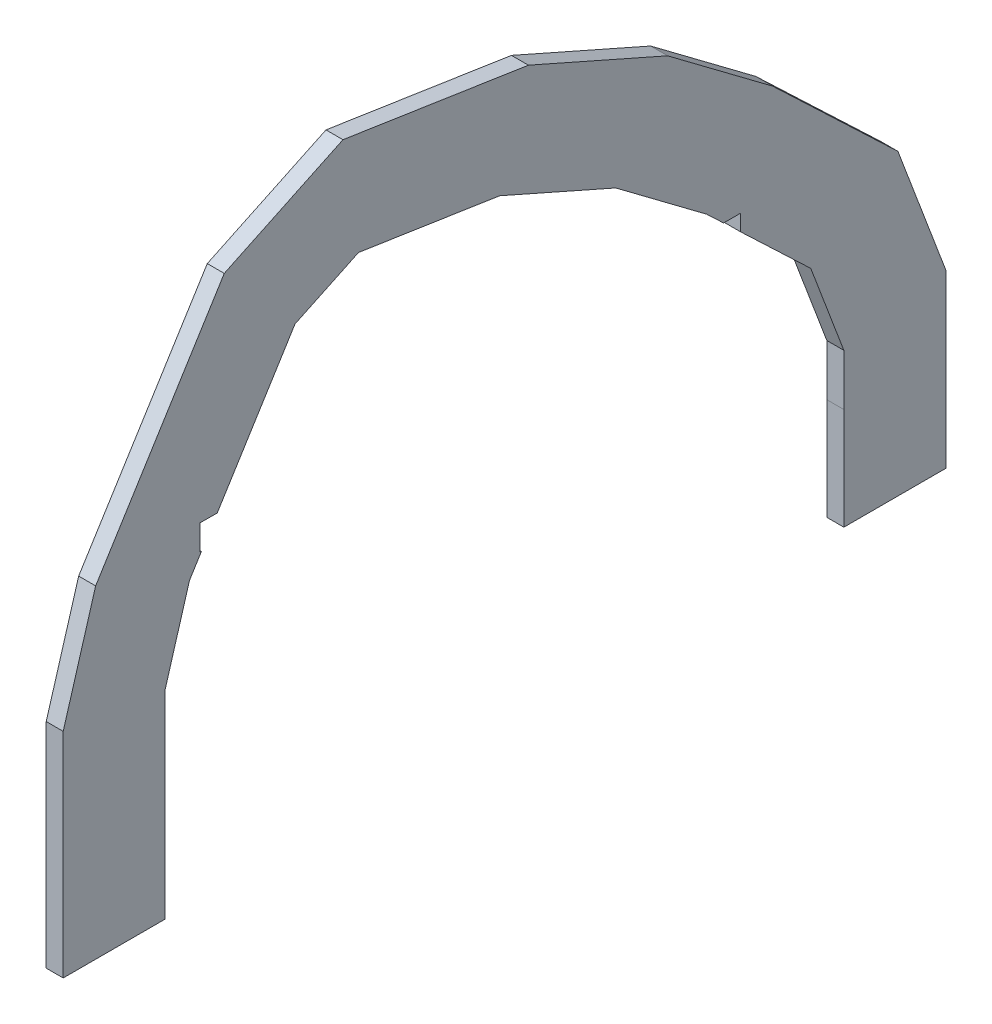
ISO-10303-21;
HEADER;
FILE_DESCRIPTION(('STEP AP214'),'2;1');
FILE_NAME('part.step','',(''),(''),'','','');
FILE_SCHEMA(('AUTOMOTIVE_DESIGN { 1 0 10303 214 1 1 1 1 }'));
ENDSEC;
DATA;
#1=APPLICATION_CONTEXT('core data for automotive mechanical design processes');
#2=APPLICATION_PROTOCOL_DEFINITION('international standard','automotive_design',2000,#1);
#3=PRODUCT_CONTEXT('',#1,'mechanical');
#4=PRODUCT('Part','Part','',(#3));
#5=PRODUCT_RELATED_PRODUCT_CATEGORY('part','',(#4));
#6=PRODUCT_DEFINITION_FORMATION('','',#4);
#7=PRODUCT_DEFINITION_CONTEXT('part definition',#1,'design');
#8=PRODUCT_DEFINITION('design','',#6,#7);
#9=PRODUCT_DEFINITION_SHAPE('','',#8);
#10=(LENGTH_UNIT() NAMED_UNIT(*) SI_UNIT(.MILLI.,.METRE.));
#11=(NAMED_UNIT(*) PLANE_ANGLE_UNIT() SI_UNIT($,.RADIAN.));
#12=(NAMED_UNIT(*) SI_UNIT($,.STERADIAN.) SOLID_ANGLE_UNIT());
#13=UNCERTAINTY_MEASURE_WITH_UNIT(LENGTH_MEASURE(1.E-05),#10,'distance_accuracy_value','');
#14=(GEOMETRIC_REPRESENTATION_CONTEXT(3) GLOBAL_UNCERTAINTY_ASSIGNED_CONTEXT((#13)) GLOBAL_UNIT_ASSIGNED_CONTEXT((#10,
#11,#12)) REPRESENTATION_CONTEXT('',''));
#15=CARTESIAN_POINT('',(0.,0.,0.));
#16=DIRECTION('',(0.,0.,1.));
#17=DIRECTION('',(1.,0.,0.));
#18=AXIS2_PLACEMENT_3D('',#15,#16,#17);
#19=CARTESIAN_POINT('',(-242.2525,21.7216118695721,64.8763127778716));
#20=DIRECTION('',(0.,0.,1.));
#21=DIRECTION('',(0.,1.,0.));
#22=AXIS2_PLACEMENT_3D('',#19,#20,#21);
#23=PLANE('',#22);
#24=DIRECTION('',(0.,-1.,0.));
#25=VECTOR('',#24,1.);
#26=CARTESIAN_POINT('',(-243.04625,39.5808520808741,64.8763127778719));
#27=LINE('',#26,#25);
#28=CARTESIAN_POINT('',(-243.04625,39.8318688402039,64.8763127778719));
#29=VERTEX_POINT('',#28);
#30=CARTESIAN_POINT('',(-243.04625,21.7216118695721,64.8763127778716));
#31=VERTEX_POINT('',#30);
#32=EDGE_CURVE('E11',#29,#31,#27,.T.);
#33=ORIENTED_EDGE('',*,*,#32,.T.);
#34=DIRECTION('',(-1.,0.,0.));
#35=VECTOR('',#34,1.);
#36=CARTESIAN_POINT('',(-242.2525,21.7216118695721,64.8763127778716));
#37=LINE('',#36,#35);
#38=CARTESIAN_POINT('',(-246.22125,21.7216118695721,64.8763127778716));
#39=VERTEX_POINT('',#38);
#40=EDGE_CURVE('E25',#31,#39,#37,.T.);
#41=ORIENTED_EDGE('',*,*,#40,.T.);
#42=DIRECTION('',(0.,-1.,0.));
#43=VECTOR('',#42,1.);
#44=CARTESIAN_POINT('',(-246.22125,39.5808520808741,64.8763127778719));
#45=LINE('',#44,#43);
#46=CARTESIAN_POINT('',(-246.22125,39.8318688402039,64.8763127778719));
#47=VERTEX_POINT('',#46);
#48=EDGE_CURVE('E619',#47,#39,#45,.T.);
#49=ORIENTED_EDGE('',*,*,#48,.F.);
#50=DIRECTION('',(-1.,0.,0.));
#51=VECTOR('',#50,1.);
#52=CARTESIAN_POINT('',(-242.2525,39.8318688402039,64.8763127778719));
#53=LINE('',#52,#51);
#54=EDGE_CURVE('E614',#29,#47,#53,.T.);
#55=ORIENTED_EDGE('',*,*,#54,.F.);
#56=EDGE_LOOP('',(#33,#41,#49,#55));
#57=FACE_BOUND('',#56,.T.);
#58=ADVANCED_FACE('F17',(#57),#23,.F.);
#59=CARTESIAN_POINT('',(-242.2525,39.8318688402039,64.8763127778719));
#60=DIRECTION('',(0.,0.283628441859663,0.958934255811242));
#61=DIRECTION('',(0.,0.958934255811242,-0.283628441859663));
#62=AXIS2_PLACEMENT_3D('',#59,#60,#61);
#63=PLANE('',#62);
#64=DIRECTION('',(0.,-0.958934255811242,0.283628441859663));
#65=VECTOR('',#64,1.);
#66=CARTESIAN_POINT('',(-243.04625,56.552923178474,59.9306488186651));
#67=LINE('',#66,#65);
#68=CARTESIAN_POINT('',(-243.04625,55.2187233128009,60.3252713141457));
#69=VERTEX_POINT('',#68);
#70=EDGE_CURVE('E609',#69,#29,#67,.T.);
#71=ORIENTED_EDGE('',*,*,#70,.T.);
#72=ORIENTED_EDGE('',*,*,#54,.T.);
#73=DIRECTION('',(0.,-0.958934255811242,0.283628441859663));
#74=VECTOR('',#73,1.);
#75=CARTESIAN_POINT('',(-246.22125,56.552923178474,59.9306488186651));
#76=LINE('',#75,#74);
#77=CARTESIAN_POINT('',(-246.22125,55.2187233128009,60.3252713141457));
#78=VERTEX_POINT('',#77);
#79=EDGE_CURVE('E604',#78,#47,#76,.T.);
#80=ORIENTED_EDGE('',*,*,#79,.F.);
#81=DIRECTION('',(-1.,0.,0.));
#82=VECTOR('',#81,1.);
#83=CARTESIAN_POINT('',(-242.2525,55.2187233128009,60.3252713141457));
#84=LINE('',#83,#82);
#85=EDGE_CURVE('E599',#69,#78,#84,.T.);
#86=ORIENTED_EDGE('',*,*,#85,.F.);
#87=EDGE_LOOP('',(#71,#72,#80,#86));
#88=FACE_BOUND('',#87,.T.);
#89=ADVANCED_FACE('F631',(#88),#63,.F.);
#90=CARTESIAN_POINT('',(-242.2525,86.8551251460985,40.6098324904967));
#91=DIRECTION('',(0.,0.903198661850357,0.429222759452158));
#92=DIRECTION('',(0.,0.429222759452158,-0.903198661850357));
#93=AXIS2_PLACEMENT_3D('',#90,#91,#92);
#94=PLANE('',#93);
#95=DIRECTION('',(0.,-0.429222759452158,0.903198661850357));
#96=VECTOR('',#95,1.);
#97=CARTESIAN_POINT('',(-243.04625,91.7358743855203,30.3394400548774));
#98=LINE('',#97,#96);
#99=CARTESIAN_POINT('',(-243.04625,92.4989777646315,28.733667910487));
#100=VERTEX_POINT('',#99);
#101=CARTESIAN_POINT('',(-243.04625,86.8551251460985,40.6098324904967));
#102=VERTEX_POINT('',#101);
#103=EDGE_CURVE('E595',#100,#102,#98,.T.);
#104=ORIENTED_EDGE('',*,*,#103,.T.);
#105=DIRECTION('',(-1.,0.,0.));
#106=VECTOR('',#105,1.);
#107=CARTESIAN_POINT('',(-242.2525,86.8551251460985,40.6098324904967));
#108=LINE('',#107,#106);
#109=CARTESIAN_POINT('',(-246.22125,86.8551251460985,40.6098324904967));
#110=VERTEX_POINT('',#109);
#111=EDGE_CURVE('E591',#102,#110,#108,.T.);
#112=ORIENTED_EDGE('',*,*,#111,.T.);
#113=DIRECTION('',(0.,-0.429222759452158,0.903198661850357));
#114=VECTOR('',#113,1.);
#115=CARTESIAN_POINT('',(-246.22125,91.7358743855203,30.3394400548774));
#116=LINE('',#115,#114);
#117=CARTESIAN_POINT('',(-246.22125,92.4989777646315,28.733667910487));
#118=VERTEX_POINT('',#117);
#119=EDGE_CURVE('E586',#118,#110,#116,.T.);
#120=ORIENTED_EDGE('',*,*,#119,.F.);
#121=DIRECTION('',(-1.,0.,0.));
#122=VECTOR('',#121,1.);
#123=CARTESIAN_POINT('',(-242.2525,92.4989777646315,28.733667910487));
#124=LINE('',#123,#122);
#125=EDGE_CURVE('E581',#100,#118,#124,.T.);
#126=ORIENTED_EDGE('',*,*,#125,.F.);
#127=EDGE_LOOP('',(#104,#112,#120,#126));
#128=FACE_BOUND('',#127,.T.);
#129=ADVANCED_FACE('F743',(#128),#94,.F.);
#130=CARTESIAN_POINT('',(-242.2525,92.4989777646315,28.733667910487));
#131=DIRECTION('',(0.,0.988632708021303,-0.150350818522763));
#132=DIRECTION('',(0.,-0.150350818522763,-0.988632708021303));
#133=AXIS2_PLACEMENT_3D('',#130,#131,#132);
#134=PLANE('',#133);
#135=DIRECTION('',(0.,0.150350818522763,0.988632708021303));
#136=VECTOR('',#135,1.);
#137=CARTESIAN_POINT('',(-243.04625,90.0750743923446,12.7952767632303));
#138=LINE('',#137,#136);
#139=CARTESIAN_POINT('',(-243.04625,88.4862440070625,2.34791304535225));
#140=VERTEX_POINT('',#139);
#141=EDGE_CURVE('E576',#140,#100,#138,.T.);
#142=ORIENTED_EDGE('',*,*,#141,.T.);
#143=ORIENTED_EDGE('',*,*,#125,.T.);
#144=DIRECTION('',(0.,0.150350818522763,0.988632708021303));
#145=VECTOR('',#144,1.);
#146=CARTESIAN_POINT('',(-246.22125,90.0750743923446,12.7952767632303));
#147=LINE('',#146,#145);
#148=CARTESIAN_POINT('',(-246.22125,88.4862440070625,2.34791304535225));
#149=VERTEX_POINT('',#148);
#150=EDGE_CURVE('E571',#149,#118,#147,.T.);
#151=ORIENTED_EDGE('',*,*,#150,.F.);
#152=DIRECTION('',(-1.,0.,0.));
#153=VECTOR('',#152,1.);
#154=CARTESIAN_POINT('',(-242.2525,88.4862440070625,2.34791304535225));
#155=LINE('',#154,#153);
#156=EDGE_CURVE('E566',#140,#149,#155,.T.);
#157=ORIENTED_EDGE('',*,*,#156,.F.);
#158=EDGE_LOOP('',(#142,#143,#151,#157));
#159=FACE_BOUND('',#158,.T.);
#160=ADVANCED_FACE('F745',(#159),#134,.F.);
#161=CARTESIAN_POINT('',(-242.2525,88.4862440070625,2.34791304535225));
#162=DIRECTION('',(0.,0.914750423770287,-0.404019383460843));
#163=DIRECTION('',(0.,-0.404019383460843,-0.914750423770287));
#164=AXIS2_PLACEMENT_3D('',#161,#162,#163);
#165=PLANE('',#164);
#166=DIRECTION('',(0.,0.404019383460843,0.914750423770287));
#167=VECTOR('',#166,1.);
#168=CARTESIAN_POINT('',(-243.04625,85.7867162691822,-3.76415544268102));
#169=LINE('',#168,#167);
#170=CARTESIAN_POINT('',(-243.04625,78.9085643907598,-19.3371516975827));
#171=VERTEX_POINT('',#170);
#172=EDGE_CURVE('E561',#171,#140,#169,.T.);
#173=ORIENTED_EDGE('',*,*,#172,.T.);
#174=ORIENTED_EDGE('',*,*,#156,.T.);
#175=DIRECTION('',(0.,0.404019383460843,0.914750423770287));
#176=VECTOR('',#175,1.);
#177=CARTESIAN_POINT('',(-246.22125,85.7867162691822,-3.76415544268102));
#178=LINE('',#177,#176);
#179=CARTESIAN_POINT('',(-246.22125,78.9085643907598,-19.3371516975827));
#180=VERTEX_POINT('',#179);
#181=EDGE_CURVE('E556',#180,#149,#178,.T.);
#182=ORIENTED_EDGE('',*,*,#181,.F.);
#183=DIRECTION('',(-1.,0.,0.));
#184=VECTOR('',#183,1.);
#185=CARTESIAN_POINT('',(-242.2525,78.9085643907598,-19.3371516975827));
#186=LINE('',#185,#184);
#187=EDGE_CURVE('E551',#171,#180,#186,.T.);
#188=ORIENTED_EDGE('',*,*,#187,.F.);
#189=EDGE_LOOP('',(#173,#174,#182,#188));
#190=FACE_BOUND('',#189,.T.);
#191=ADVANCED_FACE('F747',(#190),#165,.F.);
#192=CARTESIAN_POINT('',(-242.2525,78.9085643907598,-19.3371516975827));
#193=DIRECTION('',(0.,0.8,-0.6));
#194=DIRECTION('',(0.,-0.6,-0.8));
#195=AXIS2_PLACEMENT_3D('',#192,#193,#194);
#196=PLANE('',#195);
#197=DIRECTION('',(0.,0.6,0.8));
#198=VECTOR('',#197,1.);
#199=CARTESIAN_POINT('',(-243.04625,80.0334853187689,-17.8372571269038));
#200=LINE('',#199,#198);
#201=CARTESIAN_POINT('',(-243.04625,66.1491293884108,-36.3497317007145));
#202=VERTEX_POINT('',#201);
#203=EDGE_CURVE('E546',#202,#171,#200,.T.);
#204=ORIENTED_EDGE('',*,*,#203,.T.);
#205=ORIENTED_EDGE('',*,*,#187,.T.);
#206=DIRECTION('',(0.,0.6,0.8));
#207=VECTOR('',#206,1.);
#208=CARTESIAN_POINT('',(-246.22125,80.0334853187689,-17.8372571269038));
#209=LINE('',#208,#207);
#210=CARTESIAN_POINT('',(-246.22125,66.1491293884108,-36.3497317007145));
#211=VERTEX_POINT('',#210);
#212=EDGE_CURVE('E541',#211,#180,#209,.T.);
#213=ORIENTED_EDGE('',*,*,#212,.F.);
#214=DIRECTION('',(-1.,0.,0.));
#215=VECTOR('',#214,1.);
#216=CARTESIAN_POINT('',(-242.2525,66.1491293884108,-36.3497317007145));
#217=LINE('',#216,#215);
#218=EDGE_CURVE('E536',#202,#211,#217,.T.);
#219=ORIENTED_EDGE('',*,*,#218,.F.);
#220=EDGE_LOOP('',(#204,#205,#213,#219));
#221=FACE_BOUND('',#220,.T.);
#222=ADVANCED_FACE('F752',(#221),#196,.F.);
#223=CARTESIAN_POINT('',(-242.2525,47.6703951341775,-55.7884002019211));
#224=DIRECTION('',(0.,0.353622392329075,-0.935388263580136));
#225=DIRECTION('',(0.,-0.935388263580136,-0.353622392329075));
#226=AXIS2_PLACEMENT_3D('',#223,#224,#225);
#227=PLANE('',#226);
#228=DIRECTION('',(0.,0.935388263580136,0.353622392329075));
#229=VECTOR('',#228,1.);
#230=CARTESIAN_POINT('',(-243.04625,61.411120374268,-50.5937357818869));
#231=LINE('',#230,#229);
#232=CARTESIAN_POINT('',(-243.04625,31.3096314557018,-61.9735669584178));
#233=VERTEX_POINT('',#232);
#234=CARTESIAN_POINT('',(-243.04625,47.6703951341775,-55.7884002019211));
#235=VERTEX_POINT('',#234);
#236=EDGE_CURVE('E532',#233,#235,#231,.T.);
#237=ORIENTED_EDGE('',*,*,#236,.T.);
#238=DIRECTION('',(-1.,0.,0.));
#239=VECTOR('',#238,1.);
#240=CARTESIAN_POINT('',(-242.2525,47.6703951341775,-55.7884002019211));
#241=LINE('',#240,#239);
#242=CARTESIAN_POINT('',(-246.22125,47.6703951341775,-55.7884002019211));
#243=VERTEX_POINT('',#242);
#244=EDGE_CURVE('E528',#235,#243,#241,.T.);
#245=ORIENTED_EDGE('',*,*,#244,.T.);
#246=DIRECTION('',(0.,0.935388263580136,0.353622392329075));
#247=VECTOR('',#246,1.);
#248=CARTESIAN_POINT('',(-246.22125,61.411120374268,-50.5937357818869));
#249=LINE('',#248,#247);
#250=CARTESIAN_POINT('',(-246.22125,31.3096314557018,-61.9735669584178));
#251=VERTEX_POINT('',#250);
#252=EDGE_CURVE('E523',#251,#243,#249,.T.);
#253=ORIENTED_EDGE('',*,*,#252,.F.);
#254=DIRECTION('',(-1.,0.,0.));
#255=VECTOR('',#254,1.);
#256=CARTESIAN_POINT('',(-242.2525,31.3096314557018,-61.9735669584178));
#257=LINE('',#256,#255);
#258=EDGE_CURVE('E518',#233,#251,#257,.T.);
#259=ORIENTED_EDGE('',*,*,#258,.F.);
#260=EDGE_LOOP('',(#237,#245,#253,#259));
#261=FACE_BOUND('',#260,.T.);
#262=ADVANCED_FACE('F680',(#261),#227,.F.);
#263=CARTESIAN_POINT('',(-242.2525,31.3096314557018,-61.9735669584178));
#264=DIRECTION('',(0.,0.,-1.));
#265=DIRECTION('',(0.,-1.,0.));
#266=AXIS2_PLACEMENT_3D('',#263,#264,#265);
#267=PLANE('',#266);
#268=DIRECTION('',(0.,1.,0.));
#269=VECTOR('',#268,1.);
#270=CARTESIAN_POINT('',(-243.04625,44.374861873939,-61.9735669584178));
#271=LINE('',#270,#269);
#272=CARTESIAN_POINT('',(-243.04625,21.7303834460125,-61.9735669584178));
#273=VERTEX_POINT('',#272);
#274=EDGE_CURVE('E513',#273,#233,#271,.T.);
#275=ORIENTED_EDGE('',*,*,#274,.T.);
#276=ORIENTED_EDGE('',*,*,#258,.T.);
#277=DIRECTION('',(0.,1.,0.));
#278=VECTOR('',#277,1.);
#279=CARTESIAN_POINT('',(-246.22125,44.374861873939,-61.9735669584178));
#280=LINE('',#279,#278);
#281=CARTESIAN_POINT('',(-246.22125,21.7303834460125,-61.9735669584178));
#282=VERTEX_POINT('',#281);
#283=EDGE_CURVE('E508',#282,#251,#280,.T.);
#284=ORIENTED_EDGE('',*,*,#283,.F.);
#285=DIRECTION('',(-1.,0.,0.));
#286=VECTOR('',#285,1.);
#287=CARTESIAN_POINT('',(-242.2525,21.7303834460125,-61.9735669584178));
#288=LINE('',#287,#286);
#289=EDGE_CURVE('E503',#273,#282,#288,.T.);
#290=ORIENTED_EDGE('',*,*,#289,.F.);
#291=EDGE_LOOP('',(#275,#276,#284,#290));
#292=FACE_BOUND('',#291,.T.);
#293=ADVANCED_FACE('F677',(#292),#267,.F.);
#294=CARTESIAN_POINT('',(-242.2525,21.7303834460125,-61.9735669584178));
#295=DIRECTION('',(0.,6.91492687073141E-05,-0.999999997609189));
#296=DIRECTION('',(0.,-0.999999997609189,-6.91492687073141E-05));
#297=AXIS2_PLACEMENT_3D('',#294,#295,#296);
#298=PLANE('',#297);
#299=DIRECTION('',(0.,0.999999997609189,6.91492687073141E-05));
#300=VECTOR('',#299,1.);
#301=CARTESIAN_POINT('',(-243.04625,39.5874306778188,-61.9723321566575));
#302=LINE('',#301,#300);
#303=CARTESIAN_POINT('',(-243.04625,2.68038349155748,-61.9748842519868));
#304=VERTEX_POINT('',#303);
#305=EDGE_CURVE('E498',#304,#273,#302,.T.);
#306=ORIENTED_EDGE('',*,*,#305,.T.);
#307=ORIENTED_EDGE('',*,*,#289,.T.);
#308=DIRECTION('',(0.,0.999999997609189,6.91492687073141E-05));
#309=VECTOR('',#308,1.);
#310=CARTESIAN_POINT('',(-246.22125,39.5874306778188,-61.9723321566575));
#311=LINE('',#310,#309);
#312=CARTESIAN_POINT('',(-246.22125,2.68038349155748,-61.9748842519868));
#313=VERTEX_POINT('',#312);
#314=EDGE_CURVE('E495',#313,#282,#311,.T.);
#315=ORIENTED_EDGE('',*,*,#314,.F.);
#316=DIRECTION('',(-1.,0.,0.));
#317=VECTOR('',#316,1.);
#318=CARTESIAN_POINT('',(-242.2525,2.68038349155748,-61.9748842519867));
#319=LINE('',#318,#317);
#320=EDGE_CURVE('E492',#304,#313,#319,.T.);
#321=ORIENTED_EDGE('',*,*,#320,.F.);
#322=EDGE_LOOP('',(#306,#307,#315,#321));
#323=FACE_BOUND('',#322,.T.);
#324=ADVANCED_FACE('F673',(#323),#298,.F.);
#325=CARTESIAN_POINT('',(-242.2525,2.67029453045518,83.9263127778719));
#326=DIRECTION('',(0.,0.999999997609189,6.9149268707677E-05));
#327=DIRECTION('',(0.,6.9149268707677E-05,-0.999999997609189));
#328=AXIS2_PLACEMENT_3D('',#325,#326,#327);
#329=PLANE('',#328);
#330=DIRECTION('',(0.,-6.9149268707677E-05,0.999999997609189));
#331=VECTOR('',#330,1.);
#332=CARTESIAN_POINT('',(-243.04625,2.67029453045518,83.9263127778719));
#333=LINE('',#332,#331);
#334=CARTESIAN_POINT('',(-243.04625,2.68170069403962,-81.0235669584178));
#335=VERTEX_POINT('',#334);
#336=EDGE_CURVE('E489',#335,#304,#333,.T.);
#337=ORIENTED_EDGE('',*,*,#336,.T.);
#338=ORIENTED_EDGE('',*,*,#320,.T.);
#339=DIRECTION('',(0.,-6.9149268707677E-05,0.999999997609189));
#340=VECTOR('',#339,1.);
#341=CARTESIAN_POINT('',(-246.22125,2.67599787410856,1.44758601263741));
#342=LINE('',#341,#340);
#343=CARTESIAN_POINT('',(-246.22125,2.68170069403962,-81.0235669584178));
#344=VERTEX_POINT('',#343);
#345=EDGE_CURVE('E486',#344,#313,#342,.T.);
#346=ORIENTED_EDGE('',*,*,#345,.F.);
#347=DIRECTION('',(-1.,0.,0.));
#348=VECTOR('',#347,1.);
#349=CARTESIAN_POINT('',(-242.2525,2.68170069403962,-81.0235669584178));
#350=LINE('',#349,#348);
#351=EDGE_CURVE('E481',#335,#344,#350,.T.);
#352=ORIENTED_EDGE('',*,*,#351,.F.);
#353=EDGE_LOOP('',(#337,#338,#346,#352));
#354=FACE_BOUND('',#353,.T.);
#355=ADVANCED_FACE('F670',(#354),#329,.F.);
#356=CARTESIAN_POINT('',(-242.2525,2.68170069403962,-81.0235669584178));
#357=DIRECTION('',(0.,0.,1.));
#358=DIRECTION('',(0.,1.,0.));
#359=AXIS2_PLACEMENT_3D('',#356,#357,#358);
#360=PLANE('',#359);
#361=DIRECTION('',(0.,-1.,0.));
#362=VECTOR('',#361,1.);
#363=CARTESIAN_POINT('',(-243.04625,30.0608964931079,-81.0235669584178));
#364=LINE('',#363,#362);
#365=CARTESIAN_POINT('',(-243.04625,34.7903317888782,-81.0235669584178));
#366=VERTEX_POINT('',#365);
#367=EDGE_CURVE('E476',#366,#335,#364,.T.);
#368=ORIENTED_EDGE('',*,*,#367,.T.);
#369=ORIENTED_EDGE('',*,*,#351,.T.);
#370=DIRECTION('',(0.,-1.,0.));
#371=VECTOR('',#370,1.);
#372=CARTESIAN_POINT('',(-246.22125,30.0608964931079,-81.0235669584178));
#373=LINE('',#372,#371);
#374=CARTESIAN_POINT('',(-246.22125,34.7903317888782,-81.0235669584178));
#375=VERTEX_POINT('',#374);
#376=EDGE_CURVE('E471',#375,#344,#373,.T.);
#377=ORIENTED_EDGE('',*,*,#376,.F.);
#378=DIRECTION('',(-1.,0.,0.));
#379=VECTOR('',#378,1.);
#380=CARTESIAN_POINT('',(-242.2525,34.7903317888782,-81.0235669584178));
#381=LINE('',#380,#379);
#382=EDGE_CURVE('E466',#366,#375,#381,.T.);
#383=ORIENTED_EDGE('',*,*,#382,.F.);
#384=EDGE_LOOP('',(#368,#369,#377,#383));
#385=FACE_BOUND('',#384,.T.);
#386=ADVANCED_FACE('F667',(#385),#360,.F.);
#387=CARTESIAN_POINT('',(-242.2525,34.7903317888782,-81.0235669584178));
#388=DIRECTION('',(0.,-0.353622392329075,0.935388263580136));
#389=DIRECTION('',(0.,0.935388263580136,0.353622392329075));
#390=AXIS2_PLACEMENT_3D('',#387,#388,#389);
#391=PLANE('',#390);
#392=DIRECTION('',(0.,-0.935388263580136,-0.353622392329075));
#393=VECTOR('',#392,1.);
#394=CARTESIAN_POINT('',(-243.04625,58.3393419885528,-72.120892370736));
#395=LINE('',#394,#393);
#396=CARTESIAN_POINT('',(-243.04625,58.4784055863839,-72.0683195471659));
#397=VERTEX_POINT('',#396);
#398=EDGE_CURVE('E461',#397,#366,#395,.T.);
#399=ORIENTED_EDGE('',*,*,#398,.T.);
#400=ORIENTED_EDGE('',*,*,#382,.T.);
#401=DIRECTION('',(0.,-0.935388263580136,-0.353622392329075));
#402=VECTOR('',#401,1.);
#403=CARTESIAN_POINT('',(-246.22125,58.3393419885528,-72.120892370736));
#404=LINE('',#403,#402);
#405=CARTESIAN_POINT('',(-246.22125,58.4784055863839,-72.0683195471659));
#406=VERTEX_POINT('',#405);
#407=EDGE_CURVE('E456',#406,#375,#404,.T.);
#408=ORIENTED_EDGE('',*,*,#407,.F.);
#409=DIRECTION('',(-1.,0.,0.));
#410=VECTOR('',#409,1.);
#411=CARTESIAN_POINT('',(-242.2525,58.4784055863839,-72.0683195471659));
#412=LINE('',#411,#410);
#413=EDGE_CURVE('E451',#397,#406,#412,.T.);
#414=ORIENTED_EDGE('',*,*,#413,.F.);
#415=EDGE_LOOP('',(#399,#400,#408,#414));
#416=FACE_BOUND('',#415,.T.);
#417=ADVANCED_FACE('F664',(#416),#391,.F.);
#418=CARTESIAN_POINT('',(-242.2525,58.4784055863839,-72.0683195471659));
#419=DIRECTION('',(0.,-0.724775993112461,0.688984586045179));
#420=DIRECTION('',(0.,0.688984586045179,0.72477599311246));
#421=AXIS2_PLACEMENT_3D('',#418,#419,#420);
#422=PLANE('',#421);
#423=DIRECTION('',(0.,-0.688984586045179,-0.72477599311246));
#424=VECTOR('',#423,1.);
#425=CARTESIAN_POINT('',(-243.04625,76.5883400272277,-53.017609291213));
#426=LINE('',#425,#424);
#427=CARTESIAN_POINT('',(-243.04625,80.7220846401393,-48.6691246984101));
#428=VERTEX_POINT('',#427);
#429=EDGE_CURVE('E446',#428,#397,#426,.T.);
#430=ORIENTED_EDGE('',*,*,#429,.T.);
#431=ORIENTED_EDGE('',*,*,#413,.T.);
#432=DIRECTION('',(0.,-0.688984586045179,-0.72477599311246));
#433=VECTOR('',#432,1.);
#434=CARTESIAN_POINT('',(-246.22125,76.5883400272277,-53.017609291213));
#435=LINE('',#434,#433);
#436=CARTESIAN_POINT('',(-246.22125,80.7220846401393,-48.6691246984101));
#437=VERTEX_POINT('',#436);
#438=EDGE_CURVE('E441',#437,#406,#435,.T.);
#439=ORIENTED_EDGE('',*,*,#438,.F.);
#440=DIRECTION('',(-1.,0.,0.));
#441=VECTOR('',#440,1.);
#442=CARTESIAN_POINT('',(-242.2525,80.7220846401393,-48.6691246984101));
#443=LINE('',#442,#441);
#444=EDGE_CURVE('E436',#428,#437,#443,.T.);
#445=ORIENTED_EDGE('',*,*,#444,.F.);
#446=EDGE_LOOP('',(#430,#431,#439,#445));
#447=FACE_BOUND('',#446,.T.);
#448=ADVANCED_FACE('F661',(#447),#422,.F.);
#449=CARTESIAN_POINT('',(-242.2525,80.7220846401393,-48.6691246984101));
#450=DIRECTION('',(0.,-0.8,0.6));
#451=DIRECTION('',(0.,0.6,0.8));
#452=AXIS2_PLACEMENT_3D('',#449,#450,#451);
#453=PLANE('',#452);
#454=DIRECTION('',(0.,-0.6,-0.8));
#455=VECTOR('',#454,1.);
#456=CARTESIAN_POINT('',(-243.04625,88.5602454434587,-38.2182436273174));
#457=LINE('',#456,#455);
#458=CARTESIAN_POINT('',(-243.04625,95.4549110263928,-29.0253561834054));
#459=VERTEX_POINT('',#458);
#460=EDGE_CURVE('E431',#459,#428,#457,.T.);
#461=ORIENTED_EDGE('',*,*,#460,.T.);
#462=ORIENTED_EDGE('',*,*,#444,.T.);
#463=DIRECTION('',(0.,-0.6,-0.8));
#464=VECTOR('',#463,1.);
#465=CARTESIAN_POINT('',(-246.22125,88.5602454434587,-38.2182436273174));
#466=LINE('',#465,#464);
#467=CARTESIAN_POINT('',(-246.22125,95.4549110263928,-29.0253561834054));
#468=VERTEX_POINT('',#467);
#469=EDGE_CURVE('E426',#468,#437,#466,.T.);
#470=ORIENTED_EDGE('',*,*,#469,.F.);
#471=DIRECTION('',(-1.,0.,0.));
#472=VECTOR('',#471,1.);
#473=CARTESIAN_POINT('',(-242.2525,95.4549110263928,-29.0253561834054));
#474=LINE('',#473,#472);
#475=EDGE_CURVE('E421',#459,#468,#474,.T.);
#476=ORIENTED_EDGE('',*,*,#475,.F.);
#477=EDGE_LOOP('',(#461,#462,#470,#476));
#478=FACE_BOUND('',#477,.T.);
#479=ADVANCED_FACE('F658',(#478),#453,.F.);
#480=CARTESIAN_POINT('',(-242.2525,95.4549110263928,-29.0253561834054));
#481=DIRECTION('',(0.,-0.914750423770287,0.404019383460843));
#482=DIRECTION('',(0.,0.404019383460843,0.914750423770287));
#483=AXIS2_PLACEMENT_3D('',#480,#481,#482);
#484=PLANE('',#483);
#485=DIRECTION('',(0.,-0.404019383460843,-0.914750423770287));
#486=VECTOR('',#485,1.);
#487=CARTESIAN_POINT('',(-243.04625,97.9840475652594,-23.2990746845244));
#488=LINE('',#487,#486);
#489=CARTESIAN_POINT('',(-243.04625,106.93798034917,-3.02625079589916));
#490=VERTEX_POINT('',#489);
#491=EDGE_CURVE('E416',#490,#459,#488,.T.);
#492=ORIENTED_EDGE('',*,*,#491,.T.);
#493=ORIENTED_EDGE('',*,*,#475,.T.);
#494=DIRECTION('',(0.,-0.404019383460843,-0.914750423770287));
#495=VECTOR('',#494,1.);
#496=CARTESIAN_POINT('',(-246.22125,97.9840475652594,-23.2990746845244));
#497=LINE('',#496,#495);
#498=CARTESIAN_POINT('',(-246.22125,106.93798034917,-3.02625079589916));
#499=VERTEX_POINT('',#498);
#500=EDGE_CURVE('E411',#499,#468,#497,.T.);
#501=ORIENTED_EDGE('',*,*,#500,.F.);
#502=DIRECTION('',(-1.,0.,0.));
#503=VECTOR('',#502,1.);
#504=CARTESIAN_POINT('',(-242.2525,106.93798034917,-3.02625079589916));
#505=LINE('',#504,#503);
#506=EDGE_CURVE('E406',#490,#499,#505,.T.);
#507=ORIENTED_EDGE('',*,*,#506,.F.);
#508=EDGE_LOOP('',(#492,#493,#501,#507));
#509=FACE_BOUND('',#508,.T.);
#510=ADVANCED_FACE('F655',(#509),#484,.F.);
#511=CARTESIAN_POINT('',(-242.2525,106.93798034917,-3.02625079589916));
#512=DIRECTION('',(0.,-0.988632708021303,0.150350818522763));
#513=DIRECTION('',(0.,0.150350818522763,0.988632708021303));
#514=AXIS2_PLACEMENT_3D('',#511,#512,#513);
#515=PLANE('',#514);
#516=DIRECTION('',(0.,-0.150350818522763,-0.988632708021303));
#517=VECTOR('',#516,1.);
#518=CARTESIAN_POINT('',(-243.04625,106.711302228517,-4.51677413639203));
#519=LINE('',#518,#517);
#520=CARTESIAN_POINT('',(-243.04625,112.209890053897,31.6392230541091));
#521=VERTEX_POINT('',#520);
#522=EDGE_CURVE('E401',#521,#490,#519,.T.);
#523=ORIENTED_EDGE('',*,*,#522,.T.);
#524=ORIENTED_EDGE('',*,*,#506,.T.);
#525=DIRECTION('',(0.,-0.150350818522763,-0.988632708021303));
#526=VECTOR('',#525,1.);
#527=CARTESIAN_POINT('',(-246.22125,106.711302228517,-4.51677413639203));
#528=LINE('',#527,#526);
#529=CARTESIAN_POINT('',(-246.22125,112.209890053897,31.6392230541091));
#530=VERTEX_POINT('',#529);
#531=EDGE_CURVE('E396',#530,#499,#528,.T.);
#532=ORIENTED_EDGE('',*,*,#531,.F.);
#533=DIRECTION('',(-1.,0.,0.));
#534=VECTOR('',#533,1.);
#535=CARTESIAN_POINT('',(-242.2525,112.209890053897,31.6392230541091));
#536=LINE('',#535,#534);
#537=EDGE_CURVE('E391',#521,#530,#536,.T.);
#538=ORIENTED_EDGE('',*,*,#537,.F.);
#539=EDGE_LOOP('',(#523,#524,#532,#538));
#540=FACE_BOUND('',#539,.T.);
#541=ADVANCED_FACE('F652',(#540),#515,.F.);
#542=CARTESIAN_POINT('',(-242.2525,112.209890053897,31.6392230541091));
#543=DIRECTION('',(0.,-0.903198661850357,-0.429222759452158));
#544=DIRECTION('',(0.,-0.429222759452158,0.903198661850357));
#545=AXIS2_PLACEMENT_3D('',#542,#543,#544);
#546=PLANE('',#545);
#547=DIRECTION('',(0.,0.429222759452158,-0.903198661850357));
#548=VECTOR('',#547,1.);
#549=CARTESIAN_POINT('',(-243.04625,113.016224093544,29.9424821204654));
#550=LINE('',#549,#548);
#551=CARTESIAN_POINT('',(-243.04625,101.666070644442,53.8262189011279));
#552=VERTEX_POINT('',#551);
#553=EDGE_CURVE('E386',#552,#521,#550,.T.);
#554=ORIENTED_EDGE('',*,*,#553,.T.);
#555=ORIENTED_EDGE('',*,*,#537,.T.);
#556=DIRECTION('',(0.,0.429222759452158,-0.903198661850357));
#557=VECTOR('',#556,1.);
#558=CARTESIAN_POINT('',(-246.22125,113.016224093544,29.9424821204654));
#559=LINE('',#558,#557);
#560=CARTESIAN_POINT('',(-246.22125,101.666070644442,53.8262189011279));
#561=VERTEX_POINT('',#560);
#562=EDGE_CURVE('E381',#561,#530,#559,.T.);
#563=ORIENTED_EDGE('',*,*,#562,.F.);
#564=DIRECTION('',(-1.,0.,0.));
#565=VECTOR('',#564,1.);
#566=CARTESIAN_POINT('',(-242.2525,101.666070644442,53.8262189011279));
#567=LINE('',#566,#565);
#568=EDGE_CURVE('E376',#552,#561,#567,.T.);
#569=ORIENTED_EDGE('',*,*,#568,.F.);
#570=EDGE_LOOP('',(#554,#555,#563,#569));
#571=FACE_BOUND('',#570,.T.);
#572=ADVANCED_FACE('F649',(#571),#546,.F.);
#573=CARTESIAN_POINT('',(-242.2525,101.666070644442,53.8262189011279));
#574=DIRECTION('',(0.,-0.528892886438516,-0.848688585215293));
#575=DIRECTION('',(0.,-0.848688585215293,0.528892886438516));
#576=AXIS2_PLACEMENT_3D('',#573,#574,#575);
#577=PLANE('',#576);
#578=DIRECTION('',(0.,0.848688585215293,-0.528892886438516));
#579=VECTOR('',#578,1.);
#580=CARTESIAN_POINT('',(-243.04625,97.4933236793401,56.4266264301049));
#581=LINE('',#580,#579);
#582=CARTESIAN_POINT('',(-243.04625,63.1004687663849,77.8598548541203));
#583=VERTEX_POINT('',#582);
#584=EDGE_CURVE('E371',#583,#552,#581,.T.);
#585=ORIENTED_EDGE('',*,*,#584,.T.);
#586=ORIENTED_EDGE('',*,*,#568,.T.);
#587=DIRECTION('',(0.,0.848688585215293,-0.528892886438516));
#588=VECTOR('',#587,1.);
#589=CARTESIAN_POINT('',(-246.22125,97.4933236793401,56.4266264301049));
#590=LINE('',#589,#588);
#591=CARTESIAN_POINT('',(-246.22125,63.1004687663849,77.8598548541203));
#592=VERTEX_POINT('',#591);
#593=EDGE_CURVE('E366',#592,#561,#590,.T.);
#594=ORIENTED_EDGE('',*,*,#593,.F.);
#595=DIRECTION('',(-1.,0.,0.));
#596=VECTOR('',#595,1.);
#597=CARTESIAN_POINT('',(-242.2525,63.1004687663849,77.8598548541203));
#598=LINE('',#597,#596);
#599=EDGE_CURVE('E361',#583,#592,#598,.T.);
#600=ORIENTED_EDGE('',*,*,#599,.F.);
#601=EDGE_LOOP('',(#585,#586,#594,#600));
#602=FACE_BOUND('',#601,.T.);
#603=ADVANCED_FACE('F646',(#602),#577,.F.);
#604=CARTESIAN_POINT('',(-242.2525,63.1004687663849,77.8598548541203));
#605=DIRECTION('',(0.,-0.283628441859663,-0.958934255811242));
#606=DIRECTION('',(0.,-0.958934255811242,0.283628441859663));
#607=AXIS2_PLACEMENT_3D('',#604,#605,#606);
#608=PLANE('',#607);
#609=DIRECTION('',(0.,0.958934255811242,-0.283628441859663));
#610=VECTOR('',#609,1.);
#611=CARTESIAN_POINT('',(-243.04625,70.8887840502779,75.5562686433914));
#612=LINE('',#611,#610);
#613=CARTESIAN_POINT('',(-243.04625,42.5900634051301,83.9263127778719));
#614=VERTEX_POINT('',#613);
#615=EDGE_CURVE('E356',#614,#583,#612,.T.);
#616=ORIENTED_EDGE('',*,*,#615,.T.);
#617=ORIENTED_EDGE('',*,*,#599,.T.);
#618=DIRECTION('',(0.,0.958934255811242,-0.283628441859663));
#619=VECTOR('',#618,1.);
#620=CARTESIAN_POINT('',(-246.22125,70.8887840502779,75.5562686433914));
#621=LINE('',#620,#619);
#622=CARTESIAN_POINT('',(-246.22125,42.5900634051301,83.9263127778719));
#623=VERTEX_POINT('',#622);
#624=EDGE_CURVE('E351',#623,#592,#621,.T.);
#625=ORIENTED_EDGE('',*,*,#624,.F.);
#626=DIRECTION('',(-1.,0.,0.));
#627=VECTOR('',#626,1.);
#628=CARTESIAN_POINT('',(-242.2525,42.5900634051301,83.9263127778719));
#629=LINE('',#628,#627);
#630=EDGE_CURVE('E346',#614,#623,#629,.T.);
#631=ORIENTED_EDGE('',*,*,#630,.F.);
#632=EDGE_LOOP('',(#616,#617,#625,#631));
#633=FACE_BOUND('',#632,.T.);
#634=ADVANCED_FACE('F643',(#633),#608,.F.);
#635=CARTESIAN_POINT('',(-242.2525,42.5900634051301,83.9263127778719));
#636=DIRECTION('',(0.,0.,-1.));
#637=DIRECTION('',(0.,-1.,0.));
#638=AXIS2_PLACEMENT_3D('',#635,#636,#637);
#639=PLANE('',#638);
#640=DIRECTION('',(0.,1.,0.));
#641=VECTOR('',#640,1.);
#642=CARTESIAN_POINT('',(-243.04625,50.0150778486529,83.9263127778719));
#643=LINE('',#642,#641);
#644=CARTESIAN_POINT('',(-243.04625,2.67029453045518,83.9263127778719));
#645=VERTEX_POINT('',#644);
#646=EDGE_CURVE('E341',#645,#614,#643,.T.);
#647=ORIENTED_EDGE('',*,*,#646,.T.);
#648=ORIENTED_EDGE('',*,*,#630,.T.);
#649=DIRECTION('',(0.,1.,0.));
#650=VECTOR('',#649,1.);
#651=CARTESIAN_POINT('',(-246.22125,50.0150778486529,83.9263127778719));
#652=LINE('',#651,#650);
#653=CARTESIAN_POINT('',(-246.22125,2.67029453045518,83.9263127778719));
#654=VERTEX_POINT('',#653);
#655=EDGE_CURVE('E336',#654,#623,#652,.T.);
#656=ORIENTED_EDGE('',*,*,#655,.F.);
#657=DIRECTION('',(-1.,0.,0.));
#658=VECTOR('',#657,1.);
#659=CARTESIAN_POINT('',(-242.2525,2.67029453045518,83.9263127778719));
#660=LINE('',#659,#658);
#661=EDGE_CURVE('E331',#645,#654,#660,.T.);
#662=ORIENTED_EDGE('',*,*,#661,.F.);
#663=EDGE_LOOP('',(#647,#648,#656,#662));
#664=FACE_BOUND('',#663,.T.);
#665=ADVANCED_FACE('F640',(#664),#639,.F.);
#666=DIRECTION('',(0.,-6.9149268707677E-05,0.999999997609189));
#667=VECTOR('',#666,1.);
#668=CARTESIAN_POINT('',(-243.04625,2.67314620228186,42.6869493952546));
#669=LINE('',#668,#667);
#670=CARTESIAN_POINT('',(-243.04625,2.67161191511709,64.8749954843027));
#671=VERTEX_POINT('',#670);
#672=EDGE_CURVE('E326',#671,#645,#669,.T.);
#673=ORIENTED_EDGE('',*,*,#672,.T.);
#674=ORIENTED_EDGE('',*,*,#661,.T.);
#675=DIRECTION('',(0.,-6.9149268707677E-05,0.999999997609189));
#676=VECTOR('',#675,1.);
#677=CARTESIAN_POINT('',(-246.22125,2.67314620228186,42.6869493952546));
#678=LINE('',#677,#676);
#679=CARTESIAN_POINT('',(-246.22125,2.67161191511709,64.8749954843027));
#680=VERTEX_POINT('',#679);
#681=EDGE_CURVE('E321',#680,#654,#678,.T.);
#682=ORIENTED_EDGE('',*,*,#681,.F.);
#683=DIRECTION('',(-1.,0.,0.));
#684=VECTOR('',#683,1.);
#685=CARTESIAN_POINT('',(-242.2525,2.67161191511709,64.8749954843027));
#686=LINE('',#685,#684);
#687=EDGE_CURVE('E316',#671,#680,#686,.T.);
#688=ORIENTED_EDGE('',*,*,#687,.F.);
#689=EDGE_LOOP('',(#673,#674,#682,#688));
#690=FACE_BOUND('',#689,.T.);
#691=ADVANCED_FACE('F638',(#690),#329,.F.);
#692=CARTESIAN_POINT('',(-242.2525,2.67161191511709,64.8749954843027));
#693=DIRECTION('',(0.,-6.91492687077803E-05,0.999999997609189));
#694=DIRECTION('',(0.,0.999999997609189,6.91492687077803E-05));
#695=AXIS2_PLACEMENT_3D('',#692,#693,#694);
#696=PLANE('',#695);
#697=DIRECTION('',(0.,-0.999999997609189,-6.91492687077803E-05));
#698=VECTOR('',#697,1.);
#699=CARTESIAN_POINT('',(-243.04625,30.0536591241508,64.8768889328476));
#700=LINE('',#699,#698);
#701=EDGE_CURVE('E311',#31,#671,#700,.T.);
#702=ORIENTED_EDGE('',*,*,#701,.T.);
#703=ORIENTED_EDGE('',*,*,#687,.T.);
#704=DIRECTION('',(0.,-0.999999997609189,-6.91492687077803E-05));
#705=VECTOR('',#704,1.);
#706=CARTESIAN_POINT('',(-246.22125,30.0536591241508,64.8768889328476));
#707=LINE('',#706,#705);
#708=EDGE_CURVE('E306',#39,#680,#707,.T.);
#709=ORIENTED_EDGE('',*,*,#708,.F.);
#710=ORIENTED_EDGE('',*,*,#40,.F.);
#711=EDGE_LOOP('',(#702,#703,#709,#710));
#712=FACE_BOUND('',#711,.T.);
#713=ADVANCED_FACE('F636',(#712),#696,.F.);
#714=CARTESIAN_POINT('',(-246.22125,57.440092292176,1.45137290972691));
#715=DIRECTION('',(1.,0.,0.));
#716=DIRECTION('',(0.,0.,-1.));
#717=AXIS2_PLACEMENT_3D('',#714,#715,#716);
#718=PLANE('',#717);
#719=DIRECTION('',(0.,-0.00392946928861688,-0.999992279605753));
#720=VECTOR('',#719,1.);
#721=CARTESIAN_POINT('',(-246.22125,63.3253762411019,-0.0438390090515553));
#722=LINE('',#721,#720);
#723=CARTESIAN_POINT('',(-246.22125,63.5546899838494,58.3131439604379));
#724=VERTEX_POINT('',#723);
#725=CARTESIAN_POINT('',(-246.22125,63.542213918858,55.1381684726899));
#726=VERTEX_POINT('',#725);
#727=EDGE_CURVE('E301',#724,#726,#722,.T.);
#728=ORIENTED_EDGE('',*,*,#727,.F.);
#729=DIRECTION('',(0.,-0.999992279605753,0.0039294692886175));
#730=VECTOR('',#729,1.);
#731=CARTESIAN_POINT('',(-246.22125,60.6091557739461,58.3247184360139));
#732=LINE('',#731,#730);
#733=CARTESIAN_POINT('',(-246.22125,58.792226752227,58.3318580579251));
#734=VERTEX_POINT('',#733);
#735=EDGE_CURVE('E297',#724,#734,#732,.T.);
#736=ORIENTED_EDGE('',*,*,#735,.T.);
#737=DIRECTION('',(0.,-0.00392946928861688,-0.999992279605753));
#738=VECTOR('',#737,1.);
#739=CARTESIAN_POINT('',(-246.22125,58.5629130094795,-0.025124911564513));
#740=LINE('',#739,#738);
#741=CARTESIAN_POINT('',(-246.22125,58.7913112490565,58.0988759335806));
#742=VERTEX_POINT('',#741);
#743=EDGE_CURVE('E232',#734,#742,#740,.T.);
#744=ORIENTED_EDGE('',*,*,#743,.T.);
#745=DIRECTION('',(0.,-0.848688585215293,0.528892886438516));
#746=VECTOR('',#745,1.);
#747=CARTESIAN_POINT('',(-246.22125,69.2319452701924,51.592393862438));
#748=LINE('',#747,#746);
#749=EDGE_CURVE('E289',#742,#78,#748,.T.);
#750=ORIENTED_EDGE('',*,*,#749,.T.);
#751=ORIENTED_EDGE('',*,*,#79,.T.);
#752=ORIENTED_EDGE('',*,*,#48,.T.);
#753=ORIENTED_EDGE('',*,*,#708,.T.);
#754=ORIENTED_EDGE('',*,*,#681,.T.);
#755=ORIENTED_EDGE('',*,*,#655,.T.);
#756=ORIENTED_EDGE('',*,*,#624,.T.);
#757=ORIENTED_EDGE('',*,*,#593,.T.);
#758=ORIENTED_EDGE('',*,*,#562,.T.);
#759=ORIENTED_EDGE('',*,*,#531,.T.);
#760=ORIENTED_EDGE('',*,*,#500,.T.);
#761=ORIENTED_EDGE('',*,*,#469,.T.);
#762=ORIENTED_EDGE('',*,*,#438,.T.);
#763=ORIENTED_EDGE('',*,*,#407,.T.);
#764=ORIENTED_EDGE('',*,*,#376,.T.);
#765=ORIENTED_EDGE('',*,*,#345,.T.);
#766=ORIENTED_EDGE('',*,*,#314,.T.);
#767=ORIENTED_EDGE('',*,*,#283,.T.);
#768=ORIENTED_EDGE('',*,*,#252,.T.);
#769=DIRECTION('',(0.,0.688984586045179,0.724775993112461));
#770=VECTOR('',#769,1.);
#771=CARTESIAN_POINT('',(-246.22125,73.5202105938451,-28.5957371859071));
#772=LINE('',#771,#770);
#773=CARTESIAN_POINT('',(-246.22125,60.1633986057572,-42.6464095370127));
#774=VERTEX_POINT('',#773);
#775=EDGE_CURVE('E285',#243,#774,#772,.T.);
#776=ORIENTED_EDGE('',*,*,#775,.T.);
#777=DIRECTION('',(0.,0.999992279605753,-0.0039294692886175));
#778=VECTOR('',#777,1.);
#779=CARTESIAN_POINT('',(-246.22125,60.2123890078897,-42.6466020447795));
#780=LINE('',#779,#778);
#781=CARTESIAN_POINT('',(-246.22125,63.1579232177932,-42.6581765203555));
#782=VERTEX_POINT('',#781);
#783=EDGE_CURVE('E281',#774,#782,#780,.T.);
#784=ORIENTED_EDGE('',*,*,#783,.T.);
#785=DIRECTION('',(0.,-0.00392946928861688,-0.999992279605753));
#786=VECTOR('',#785,1.);
#787=CARTESIAN_POINT('',(-246.22125,63.3253762411019,-0.0438390090515553));
#788=LINE('',#787,#786);
#789=CARTESIAN_POINT('',(-246.22125,63.1703992827844,-39.4832010326071));
#790=VERTEX_POINT('',#789);
#791=EDGE_CURVE('E276',#790,#782,#788,.T.);
#792=ORIENTED_EDGE('',*,*,#791,.F.);
#793=DIRECTION('',(0.,0.688984586045179,0.724775993112461));
#794=VECTOR('',#793,1.);
#795=CARTESIAN_POINT('',(-246.22125,73.5202105938451,-28.5957371859071));
#796=LINE('',#795,#794);
#797=EDGE_CURVE('E271',#790,#211,#796,.T.);
#798=ORIENTED_EDGE('',*,*,#797,.T.);
#799=ORIENTED_EDGE('',*,*,#212,.T.);
#800=ORIENTED_EDGE('',*,*,#181,.T.);
#801=ORIENTED_EDGE('',*,*,#150,.T.);
#802=ORIENTED_EDGE('',*,*,#119,.T.);
#803=DIRECTION('',(0.,-0.848688585215293,0.528892886438516));
#804=VECTOR('',#803,1.);
#805=CARTESIAN_POINT('',(-246.22125,69.2319452701924,51.592393862438));
#806=LINE('',#805,#804);
#807=EDGE_CURVE('E267',#110,#726,#806,.T.);
#808=ORIENTED_EDGE('',*,*,#807,.T.);
#809=EDGE_LOOP('',(#728,#736,#744,#750,#751,#752,#753,#754,#755,#756,#757,#758,#759,#760,#761,
#762,#763,#764,#765,#766,#767,#768,#776,#784,#792,#798,#799,#800,#801,#802,#808));
#810=FACE_BOUND('',#809,.T.);
#811=ADVANCED_FACE('F629',(#810),#718,.F.);
#812=CARTESIAN_POINT('',(-242.2525,66.1491293884108,-36.3497317007145));
#813=DIRECTION('',(0.,0.724775993112461,-0.688984586045179));
#814=DIRECTION('',(0.,-0.688984586045179,-0.724775993112461));
#815=AXIS2_PLACEMENT_3D('',#812,#813,#814);
#816=PLANE('',#815);
#817=DIRECTION('',(-1.,0.,0.));
#818=VECTOR('',#817,1.);
#819=CARTESIAN_POINT('',(-121.139554556648,63.1703992827844,-39.4832010326074));
#820=LINE('',#819,#818);
#821=CARTESIAN_POINT('',(-243.04625,63.1703992827844,-39.4832010326071));
#822=VERTEX_POINT('',#821);
#823=EDGE_CURVE('E262',#822,#790,#820,.T.);
#824=ORIENTED_EDGE('',*,*,#823,.F.);
#825=DIRECTION('',(0.,0.688984586045179,0.724775993112461));
#826=VECTOR('',#825,1.);
#827=CARTESIAN_POINT('',(-243.04625,73.5202105938451,-28.5957371859071));
#828=LINE('',#827,#826);
#829=EDGE_CURVE('E257',#822,#202,#828,.T.);
#830=ORIENTED_EDGE('',*,*,#829,.T.);
#831=ORIENTED_EDGE('',*,*,#218,.T.);
#832=ORIENTED_EDGE('',*,*,#797,.F.);
#833=EDGE_LOOP('',(#824,#830,#831,#832));
#834=FACE_BOUND('',#833,.T.);
#835=ADVANCED_FACE('F702',(#834),#816,.F.);
#836=DIRECTION('',(1.,0.,0.));
#837=VECTOR('',#836,1.);
#838=CARTESIAN_POINT('',(-244.63375,60.1633986057572,-42.6464095370127));
#839=LINE('',#838,#837);
#840=CARTESIAN_POINT('',(-243.04625,60.1633986057572,-42.6464095370127));
#841=VERTEX_POINT('',#840);
#842=EDGE_CURVE('E244',#774,#841,#839,.T.);
#843=ORIENTED_EDGE('',*,*,#842,.F.);
#844=ORIENTED_EDGE('',*,*,#775,.F.);
#845=ORIENTED_EDGE('',*,*,#244,.F.);
#846=DIRECTION('',(0.,0.688984586045179,0.724775993112461));
#847=VECTOR('',#846,1.);
#848=CARTESIAN_POINT('',(-243.04625,73.5202105938451,-28.5957371859071));
#849=LINE('',#848,#847);
#850=EDGE_CURVE('E241',#235,#841,#849,.T.);
#851=ORIENTED_EDGE('',*,*,#850,.T.);
#852=EDGE_LOOP('',(#843,#844,#845,#851));
#853=FACE_BOUND('',#852,.T.);
#854=ADVANCED_FACE('F685',(#853),#816,.F.);
#855=CARTESIAN_POINT('',(-243.04625,57.440092292176,1.45137290972691));
#856=DIRECTION('',(1.,0.,0.));
#857=DIRECTION('',(0.,0.,-1.));
#858=AXIS2_PLACEMENT_3D('',#855,#856,#857);
#859=PLANE('',#858);
#860=DIRECTION('',(0.,-0.999992279605753,0.0039294692886175));
#861=VECTOR('',#860,1.);
#862=CARTESIAN_POINT('',(-243.04625,60.6091557739461,58.3247184360139));
#863=LINE('',#862,#861);
#864=CARTESIAN_POINT('',(-243.04625,63.5546899838494,58.3131439604382));
#865=VERTEX_POINT('',#864);
#866=CARTESIAN_POINT('',(-243.04625,58.792226752227,58.3318580579251));
#867=VERTEX_POINT('',#866);
#868=EDGE_CURVE('E218',#865,#867,#863,.T.);
#869=ORIENTED_EDGE('',*,*,#868,.F.);
#870=DIRECTION('',(0.,-0.00392946928861688,-0.999992279605753));
#871=VECTOR('',#870,1.);
#872=CARTESIAN_POINT('',(-243.04625,63.3253762411019,-0.0438390090515553));
#873=LINE('',#872,#871);
#874=CARTESIAN_POINT('',(-243.04625,63.542213918858,55.1381684726899));
#875=VERTEX_POINT('',#874);
#876=EDGE_CURVE('E242',#865,#875,#873,.T.);
#877=ORIENTED_EDGE('',*,*,#876,.T.);
#878=DIRECTION('',(0.,-0.848688585215293,0.528892886438516));
#879=VECTOR('',#878,1.);
#880=CARTESIAN_POINT('',(-243.04625,69.2319452701924,51.592393862438));
#881=LINE('',#880,#879);
#882=EDGE_CURVE('E246',#102,#875,#881,.T.);
#883=ORIENTED_EDGE('',*,*,#882,.F.);
#884=ORIENTED_EDGE('',*,*,#103,.F.);
#885=ORIENTED_EDGE('',*,*,#141,.F.);
#886=ORIENTED_EDGE('',*,*,#172,.F.);
#887=ORIENTED_EDGE('',*,*,#203,.F.);
#888=ORIENTED_EDGE('',*,*,#829,.F.);
#889=DIRECTION('',(0.,-0.00392946928861688,-0.999992279605753));
#890=VECTOR('',#889,1.);
#891=CARTESIAN_POINT('',(-243.04625,63.3253762411019,-0.0438390090515553));
#892=LINE('',#891,#890);
#893=CARTESIAN_POINT('',(-243.04625,63.1579232177932,-42.6581765203555));
#894=VERTEX_POINT('',#893);
#895=EDGE_CURVE('E691',#822,#894,#892,.T.);
#896=ORIENTED_EDGE('',*,*,#895,.T.);
#897=DIRECTION('',(0.,0.999992279605753,-0.0039294692886175));
#898=VECTOR('',#897,1.);
#899=CARTESIAN_POINT('',(-243.04625,60.2123890078897,-42.6466020447795));
#900=LINE('',#899,#898);
#901=EDGE_CURVE('E688',#841,#894,#900,.T.);
#902=ORIENTED_EDGE('',*,*,#901,.F.);
#903=ORIENTED_EDGE('',*,*,#850,.F.);
#904=ORIENTED_EDGE('',*,*,#236,.F.);
#905=ORIENTED_EDGE('',*,*,#274,.F.);
#906=ORIENTED_EDGE('',*,*,#305,.F.);
#907=ORIENTED_EDGE('',*,*,#336,.F.);
#908=ORIENTED_EDGE('',*,*,#367,.F.);
#909=ORIENTED_EDGE('',*,*,#398,.F.);
#910=ORIENTED_EDGE('',*,*,#429,.F.);
#911=ORIENTED_EDGE('',*,*,#460,.F.);
#912=ORIENTED_EDGE('',*,*,#491,.F.);
#913=ORIENTED_EDGE('',*,*,#522,.F.);
#914=ORIENTED_EDGE('',*,*,#553,.F.);
#915=ORIENTED_EDGE('',*,*,#584,.F.);
#916=ORIENTED_EDGE('',*,*,#615,.F.);
#917=ORIENTED_EDGE('',*,*,#646,.F.);
#918=ORIENTED_EDGE('',*,*,#672,.F.);
#919=ORIENTED_EDGE('',*,*,#701,.F.);
#920=ORIENTED_EDGE('',*,*,#32,.F.);
#921=ORIENTED_EDGE('',*,*,#70,.F.);
#922=DIRECTION('',(0.,-0.848688585215293,0.528892886438516));
#923=VECTOR('',#922,1.);
#924=CARTESIAN_POINT('',(-243.04625,69.2319452701924,51.592393862438));
#925=LINE('',#924,#923);
#926=CARTESIAN_POINT('',(-243.04625,58.7913112490565,58.0988759335806));
#927=VERTEX_POINT('',#926);
#928=EDGE_CURVE('E222',#927,#69,#925,.T.);
#929=ORIENTED_EDGE('',*,*,#928,.F.);
#930=DIRECTION('',(0.,-0.00392946928861688,-0.999992279605753));
#931=VECTOR('',#930,1.);
#932=CARTESIAN_POINT('',(-243.04625,58.5629130094795,-0.025124911564513));
#933=LINE('',#932,#931);
#934=EDGE_CURVE('E214',#867,#927,#933,.T.);
#935=ORIENTED_EDGE('',*,*,#934,.F.);
#936=EDGE_LOOP('',(#869,#877,#883,#884,#885,#886,#887,#888,#896,#902,#903,#904,#905,#906,#907,
#908,#909,#910,#911,#912,#913,#914,#915,#916,#917,#918,#919,#920,#921,#929,#935));
#937=FACE_BOUND('',#936,.T.);
#938=ADVANCED_FACE('F216',(#937),#859,.T.);
#939=CARTESIAN_POINT('',(-242.2525,55.2187233128009,60.3252713141457));
#940=DIRECTION('',(0.,0.528892886438516,0.848688585215293));
#941=DIRECTION('',(0.,0.848688585215293,-0.528892886438516));
#942=AXIS2_PLACEMENT_3D('',#939,#940,#941);
#943=PLANE('',#942);
#944=DIRECTION('',(1.,0.,0.));
#945=VECTOR('',#944,1.);
#946=CARTESIAN_POINT('',(-121.139554556648,63.5422139188577,55.1381684726902));
#947=LINE('',#946,#945);
#948=EDGE_CURVE('E226',#726,#875,#947,.T.);
#949=ORIENTED_EDGE('',*,*,#948,.F.);
#950=ORIENTED_EDGE('',*,*,#807,.F.);
#951=ORIENTED_EDGE('',*,*,#111,.F.);
#952=ORIENTED_EDGE('',*,*,#882,.T.);
#953=EDGE_LOOP('',(#949,#950,#951,#952));
#954=FACE_BOUND('',#953,.T.);
#955=ADVANCED_FACE('F740',(#954),#943,.F.);
#956=DIRECTION('',(-1.,0.,0.));
#957=VECTOR('',#956,1.);
#958=CARTESIAN_POINT('',(-121.139554556648,58.7913112490562,58.0988759335809));
#959=LINE('',#958,#957);
#960=EDGE_CURVE('E235',#927,#742,#959,.T.);
#961=ORIENTED_EDGE('',*,*,#960,.F.);
#962=ORIENTED_EDGE('',*,*,#928,.T.);
#963=ORIENTED_EDGE('',*,*,#85,.T.);
#964=ORIENTED_EDGE('',*,*,#749,.F.);
#965=EDGE_LOOP('',(#961,#962,#963,#964));
#966=FACE_BOUND('',#965,.T.);
#967=ADVANCED_FACE('F958',(#966),#943,.F.);
#968=CARTESIAN_POINT('',(-0.0266091132968559,58.5571285385986,-1.49718787919118));
#969=DIRECTION('',(0.,-0.999992279605753,0.00392946928861688));
#970=DIRECTION('',(0.,0.00392946928861688,0.999992279605753));
#971=AXIS2_PLACEMENT_3D('',#968,#969,#970);
#972=PLANE('',#971);
#973=ORIENTED_EDGE('',*,*,#743,.F.);
#974=DIRECTION('',(-1.,0.,0.));
#975=VECTOR('',#974,1.);
#976=CARTESIAN_POINT('',(-121.139554556648,58.7922267522267,58.3318580579253));
#977=LINE('',#976,#975);
#978=EDGE_CURVE('E230',#867,#734,#977,.T.);
#979=ORIENTED_EDGE('',*,*,#978,.F.);
#980=ORIENTED_EDGE('',*,*,#934,.T.);
#981=ORIENTED_EDGE('',*,*,#960,.T.);
#982=EDGE_LOOP('',(#973,#979,#980,#981));
#983=FACE_BOUND('',#982,.T.);
#984=ADVANCED_FACE('F231',(#983),#972,.F.);
#985=CARTESIAN_POINT('',(-242.2525,63.5546899838492,58.3131439604379));
#986=DIRECTION('',(0.,0.0039294692886175,0.999992279605753));
#987=DIRECTION('',(-1.,0.,0.));
#988=AXIS2_PLACEMENT_3D('',#985,#986,#987);
#989=PLANE('',#988);
#990=ORIENTED_EDGE('',*,*,#978,.T.);
#991=ORIENTED_EDGE('',*,*,#735,.F.);
#992=DIRECTION('',(-1.,0.,0.));
#993=VECTOR('',#992,1.);
#994=CARTESIAN_POINT('',(-121.139554556648,63.5546899838492,58.3131439604384));
#995=LINE('',#994,#993);
#996=EDGE_CURVE('E236',#865,#724,#995,.T.);
#997=ORIENTED_EDGE('',*,*,#996,.F.);
#998=ORIENTED_EDGE('',*,*,#868,.T.);
#999=EDGE_LOOP('',(#990,#991,#997,#998));
#1000=FACE_BOUND('',#999,.T.);
#1001=ADVANCED_FACE('F238',(#1000),#989,.F.);
#1002=CARTESIAN_POINT('',(-247.015,63.157923217793,-42.6581765203555));
#1003=DIRECTION('',(0.,-0.0039294692886175,-0.999992279605753));
#1004=DIRECTION('',(1.,0.,0.));
#1005=AXIS2_PLACEMENT_3D('',#1002,#1003,#1004);
#1006=PLANE('',#1005);
#1007=ORIENTED_EDGE('',*,*,#842,.T.);
#1008=ORIENTED_EDGE('',*,*,#901,.T.);
#1009=DIRECTION('',(1.,0.,0.));
#1010=VECTOR('',#1009,1.);
#1011=CARTESIAN_POINT('',(-123.520804556648,63.157923217793,-42.6581765203557));
#1012=LINE('',#1011,#1010);
#1013=EDGE_CURVE('E698',#782,#894,#1012,.T.);
#1014=ORIENTED_EDGE('',*,*,#1013,.F.);
#1015=ORIENTED_EDGE('',*,*,#783,.F.);
#1016=EDGE_LOOP('',(#1007,#1008,#1014,#1015));
#1017=FACE_BOUND('',#1016,.T.);
#1018=ADVANCED_FACE('F697',(#1017),#1006,.F.);
#1019=CARTESIAN_POINT('',(-0.0266091132968559,63.3195917702211,-1.51590197667822));
#1020=DIRECTION('',(0.,-0.999992279605753,0.00392946928861688));
#1021=DIRECTION('',(0.,0.00392946928861688,0.999992279605753));
#1022=AXIS2_PLACEMENT_3D('',#1019,#1020,#1021);
#1023=PLANE('',#1022);
#1024=ORIENTED_EDGE('',*,*,#727,.T.);
#1025=ORIENTED_EDGE('',*,*,#948,.T.);
#1026=ORIENTED_EDGE('',*,*,#876,.F.);
#1027=ORIENTED_EDGE('',*,*,#996,.T.);
#1028=EDGE_LOOP('',(#1024,#1025,#1026,#1027));
#1029=FACE_BOUND('',#1028,.T.);
#1030=ADVANCED_FACE('F734',(#1029),#1023,.T.);
#1031=ORIENTED_EDGE('',*,*,#895,.F.);
#1032=ORIENTED_EDGE('',*,*,#823,.T.);
#1033=ORIENTED_EDGE('',*,*,#791,.T.);
#1034=ORIENTED_EDGE('',*,*,#1013,.T.);
#1035=EDGE_LOOP('',(#1031,#1032,#1033,#1034));
#1036=FACE_BOUND('',#1035,.T.);
#1037=ADVANCED_FACE('F703',(#1036),#1023,.T.);
#1038=CLOSED_SHELL('',(#58,#89,#129,#160,#191,#222,#262,#293,#324,#355,#386,#417,#448,#479,#510,
#541,#572,#603,#634,#665,#691,#713,#811,#835,#854,#938,#955,#967,#984,#1001,#1018,#1030,#1037));
#1039=MANIFOLD_SOLID_BREP('B1',#1038);
#1040=ADVANCED_BREP_SHAPE_REPRESENTATION('',(#18,#1039),#14);
#1041=SHAPE_DEFINITION_REPRESENTATION(#9,#1040);
ENDSEC;
END-ISO-10303-21;
